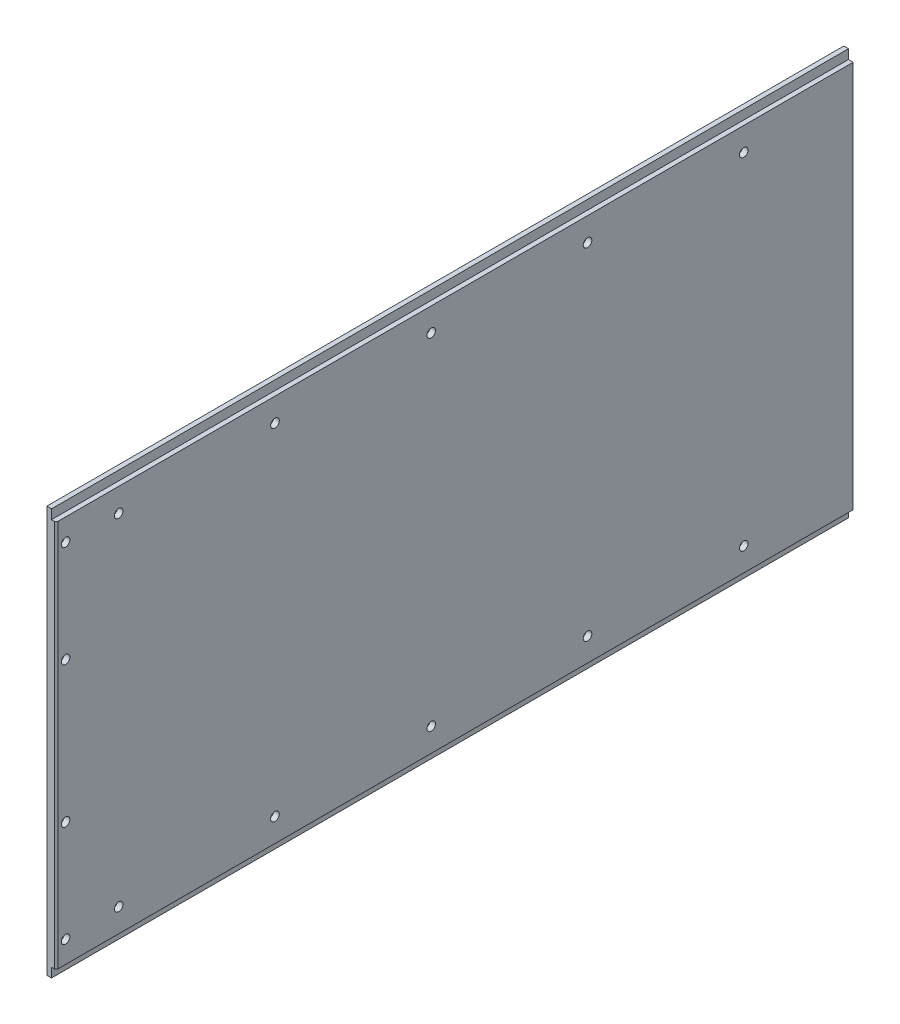
ISO-10303-21;
HEADER;
FILE_DESCRIPTION(('STEP AP214'),'2;1');
FILE_NAME('part.step','',(''),(''),'','','');
FILE_SCHEMA(('AUTOMOTIVE_DESIGN { 1 0 10303 214 1 1 1 1 }'));
ENDSEC;
DATA;
#1=APPLICATION_CONTEXT('core data for automotive mechanical design processes');
#2=APPLICATION_PROTOCOL_DEFINITION('international standard','automotive_design',2000,#1);
#3=PRODUCT_CONTEXT('',#1,'mechanical');
#4=PRODUCT('Part','Part','',(#3));
#5=PRODUCT_RELATED_PRODUCT_CATEGORY('part','',(#4));
#6=PRODUCT_DEFINITION_FORMATION('','',#4);
#7=PRODUCT_DEFINITION_CONTEXT('part definition',#1,'design');
#8=PRODUCT_DEFINITION('design','',#6,#7);
#9=PRODUCT_DEFINITION_SHAPE('','',#8);
#10=(LENGTH_UNIT() NAMED_UNIT(*) SI_UNIT(.MILLI.,.METRE.));
#11=(NAMED_UNIT(*) PLANE_ANGLE_UNIT() SI_UNIT($,.RADIAN.));
#12=(NAMED_UNIT(*) SI_UNIT($,.STERADIAN.) SOLID_ANGLE_UNIT());
#13=UNCERTAINTY_MEASURE_WITH_UNIT(LENGTH_MEASURE(1.E-05),#10,'distance_accuracy_value','');
#14=(GEOMETRIC_REPRESENTATION_CONTEXT(3) GLOBAL_UNCERTAINTY_ASSIGNED_CONTEXT((#13)) GLOBAL_UNIT_ASSIGNED_CONTEXT((#10,
#11,#12)) REPRESENTATION_CONTEXT('',''));
#15=CARTESIAN_POINT('',(0.,0.,0.));
#16=DIRECTION('',(0.,0.,1.));
#17=DIRECTION('',(1.,0.,0.));
#18=AXIS2_PLACEMENT_3D('',#15,#16,#17);
#19=CARTESIAN_POINT('',(6.,-130.,255.));
#20=DIRECTION('',(0.,0.,-1.));
#21=DIRECTION('',(-1.,0.,0.));
#22=AXIS2_PLACEMENT_3D('',#19,#20,#21);
#23=PLANE('',#22);
#24=DIRECTION('',(-1.,0.,0.));
#25=VECTOR('',#24,1.);
#26=CARTESIAN_POINT('',(6.,-124.,255.));
#27=LINE('',#26,#25);
#28=CARTESIAN_POINT('',(5.00000000000006,-124.,255.));
#29=VERTEX_POINT('',#28);
#30=CARTESIAN_POINT('',(3.,-124.,255.));
#31=VERTEX_POINT('',#30);
#32=EDGE_CURVE('E603',#29,#31,#27,.T.);
#33=ORIENTED_EDGE('',*,*,#32,.F.);
#34=DIRECTION('',(0.,1.,0.));
#35=VECTOR('',#34,1.);
#36=CARTESIAN_POINT('',(5.00000000000006,-130.,255.));
#37=LINE('',#36,#35);
#38=CARTESIAN_POINT('',(5.00000000000006,124.,255.));
#39=VERTEX_POINT('',#38);
#40=EDGE_CURVE('E49',#29,#39,#37,.T.);
#41=ORIENTED_EDGE('',*,*,#40,.T.);
#42=DIRECTION('',(1.,0.,0.));
#43=VECTOR('',#42,1.);
#44=CARTESIAN_POINT('',(6.,124.,255.));
#45=LINE('',#44,#43);
#46=CARTESIAN_POINT('',(3.,124.,255.));
#47=VERTEX_POINT('',#46);
#48=EDGE_CURVE('E117',#47,#39,#45,.T.);
#49=ORIENTED_EDGE('',*,*,#48,.F.);
#50=DIRECTION('',(0.,-1.,0.));
#51=VECTOR('',#50,1.);
#52=CARTESIAN_POINT('',(3.,130.,255.));
#53=LINE('',#52,#51);
#54=CARTESIAN_POINT('',(3.,130.,255.));
#55=VERTEX_POINT('',#54);
#56=EDGE_CURVE('E591',#55,#47,#53,.T.);
#57=ORIENTED_EDGE('',*,*,#56,.F.);
#58=DIRECTION('',(-1.,0.,0.));
#59=VECTOR('',#58,1.);
#60=CARTESIAN_POINT('',(6.,130.,255.));
#61=LINE('',#60,#59);
#62=CARTESIAN_POINT('',(0.,130.,255.));
#63=VERTEX_POINT('',#62);
#64=EDGE_CURVE('E125',#55,#63,#61,.T.);
#65=ORIENTED_EDGE('',*,*,#64,.T.);
#66=DIRECTION('',(0.,-1.,0.));
#67=VECTOR('',#66,1.);
#68=CARTESIAN_POINT('',(0.,-130.,255.));
#69=LINE('',#68,#67);
#70=CARTESIAN_POINT('',(0.,-130.,255.));
#71=VERTEX_POINT('',#70);
#72=EDGE_CURVE('E579',#63,#71,#69,.T.);
#73=ORIENTED_EDGE('',*,*,#72,.T.);
#74=DIRECTION('',(-1.,0.,0.));
#75=VECTOR('',#74,1.);
#76=CARTESIAN_POINT('',(6.,-130.,255.));
#77=LINE('',#76,#75);
#78=CARTESIAN_POINT('',(3.,-130.,255.));
#79=VERTEX_POINT('',#78);
#80=EDGE_CURVE('E133',#79,#71,#77,.T.);
#81=ORIENTED_EDGE('',*,*,#80,.F.);
#82=DIRECTION('',(0.,-1.,0.));
#83=VECTOR('',#82,1.);
#84=CARTESIAN_POINT('',(3.,-130.,255.));
#85=LINE('',#84,#83);
#86=EDGE_CURVE('E605',#31,#79,#85,.T.);
#87=ORIENTED_EDGE('',*,*,#86,.F.);
#88=EDGE_LOOP('',(#33,#41,#49,#57,#65,#73,#81,#87));
#89=FACE_BOUND('',#88,.T.);
#90=ADVANCED_FACE('F34',(#89),#23,.F.);
#91=CARTESIAN_POINT('',(6.,-130.,-255.));
#92=DIRECTION('',(0.,1.,0.));
#93=DIRECTION('',(0.,0.,1.));
#94=AXIS2_PLACEMENT_3D('',#91,#92,#93);
#95=PLANE('',#94);
#96=DIRECTION('',(-1.,0.,0.));
#97=VECTOR('',#96,1.);
#98=CARTESIAN_POINT('',(6.,-130.,-255.));
#99=LINE('',#98,#97);
#100=CARTESIAN_POINT('',(3.,-130.,-255.));
#101=VERTEX_POINT('',#100);
#102=CARTESIAN_POINT('',(0.,-130.,-255.));
#103=VERTEX_POINT('',#102);
#104=EDGE_CURVE('E131',#101,#103,#99,.T.);
#105=ORIENTED_EDGE('',*,*,#104,.F.);
#106=DIRECTION('',(0.,0.,1.));
#107=VECTOR('',#106,1.);
#108=CARTESIAN_POINT('',(3.,-130.,-255.));
#109=LINE('',#108,#107);
#110=EDGE_CURVE('E571',#101,#79,#109,.T.);
#111=ORIENTED_EDGE('',*,*,#110,.T.);
#112=ORIENTED_EDGE('',*,*,#80,.T.);
#113=DIRECTION('',(0.,0.,-1.));
#114=VECTOR('',#113,1.);
#115=CARTESIAN_POINT('',(0.,-130.,-255.));
#116=LINE('',#115,#114);
#117=EDGE_CURVE('E582',#71,#103,#116,.T.);
#118=ORIENTED_EDGE('',*,*,#117,.T.);
#119=EDGE_LOOP('',(#105,#111,#112,#118));
#120=FACE_BOUND('',#119,.T.);
#121=ADVANCED_FACE('F201',(#120),#95,.F.);
#122=CARTESIAN_POINT('',(6.,130.,-255.));
#123=DIRECTION('',(0.,0.,1.));
#124=DIRECTION('',(1.,0.,0.));
#125=AXIS2_PLACEMENT_3D('',#122,#123,#124);
#126=PLANE('',#125);
#127=DIRECTION('',(0.,-1.,0.));
#128=VECTOR('',#127,1.);
#129=CARTESIAN_POINT('',(3.,130.,-255.));
#130=LINE('',#129,#128);
#131=CARTESIAN_POINT('',(3.,130.,-255.));
#132=VERTEX_POINT('',#131);
#133=CARTESIAN_POINT('',(3.,124.,-255.));
#134=VERTEX_POINT('',#133);
#135=EDGE_CURVE('E105',#132,#134,#130,.T.);
#136=ORIENTED_EDGE('',*,*,#135,.T.);
#137=DIRECTION('',(1.,0.,0.));
#138=VECTOR('',#137,1.);
#139=CARTESIAN_POINT('',(6.,124.,-255.));
#140=LINE('',#139,#138);
#141=CARTESIAN_POINT('',(6.,124.,-255.));
#142=VERTEX_POINT('',#141);
#143=EDGE_CURVE('E116',#134,#142,#140,.T.);
#144=ORIENTED_EDGE('',*,*,#143,.T.);
#145=DIRECTION('',(0.,1.,0.));
#146=VECTOR('',#145,1.);
#147=CARTESIAN_POINT('',(6.,130.,-255.));
#148=LINE('',#147,#146);
#149=CARTESIAN_POINT('',(6.,-124.,-255.));
#150=VERTEX_POINT('',#149);
#151=EDGE_CURVE('E135',#150,#142,#148,.T.);
#152=ORIENTED_EDGE('',*,*,#151,.F.);
#153=DIRECTION('',(-1.,0.,0.));
#154=VECTOR('',#153,1.);
#155=CARTESIAN_POINT('',(6.,-124.,-255.));
#156=LINE('',#155,#154);
#157=CARTESIAN_POINT('',(3.,-124.,-255.));
#158=VERTEX_POINT('',#157);
#159=EDGE_CURVE('E563',#150,#158,#156,.T.);
#160=ORIENTED_EDGE('',*,*,#159,.T.);
#161=DIRECTION('',(0.,-1.,0.));
#162=VECTOR('',#161,1.);
#163=CARTESIAN_POINT('',(3.,-130.,-255.));
#164=LINE('',#163,#162);
#165=EDGE_CURVE('E568',#158,#101,#164,.T.);
#166=ORIENTED_EDGE('',*,*,#165,.T.);
#167=ORIENTED_EDGE('',*,*,#104,.T.);
#168=DIRECTION('',(0.,1.,0.));
#169=VECTOR('',#168,1.);
#170=CARTESIAN_POINT('',(0.,130.,-255.));
#171=LINE('',#170,#169);
#172=CARTESIAN_POINT('',(0.,130.,-255.));
#173=VERTEX_POINT('',#172);
#174=EDGE_CURVE('E129',#103,#173,#171,.T.);
#175=ORIENTED_EDGE('',*,*,#174,.T.);
#176=DIRECTION('',(-1.,0.,0.));
#177=VECTOR('',#176,1.);
#178=CARTESIAN_POINT('',(6.,130.,-255.));
#179=LINE('',#178,#177);
#180=EDGE_CURVE('E123',#132,#173,#179,.T.);
#181=ORIENTED_EDGE('',*,*,#180,.F.);
#182=EDGE_LOOP('',(#136,#144,#152,#160,#166,#167,#175,#181));
#183=FACE_BOUND('',#182,.T.);
#184=ADVANCED_FACE('F127',(#183),#126,.F.);
#185=CARTESIAN_POINT('',(6.,130.,255.));
#186=DIRECTION('',(0.,-1.,0.));
#187=DIRECTION('',(0.,0.,-1.));
#188=AXIS2_PLACEMENT_3D('',#185,#186,#187);
#189=PLANE('',#188);
#190=ORIENTED_EDGE('',*,*,#64,.F.);
#191=DIRECTION('',(0.,0.,1.));
#192=VECTOR('',#191,1.);
#193=CARTESIAN_POINT('',(3.,130.,-255.));
#194=LINE('',#193,#192);
#195=EDGE_CURVE('E109',#132,#55,#194,.T.);
#196=ORIENTED_EDGE('',*,*,#195,.F.);
#197=ORIENTED_EDGE('',*,*,#180,.T.);
#198=DIRECTION('',(0.,0.,1.));
#199=VECTOR('',#198,1.);
#200=CARTESIAN_POINT('',(0.,130.,255.));
#201=LINE('',#200,#199);
#202=EDGE_CURVE('E578',#173,#63,#201,.T.);
#203=ORIENTED_EDGE('',*,*,#202,.T.);
#204=EDGE_LOOP('',(#190,#196,#197,#203));
#205=FACE_BOUND('',#204,.T.);
#206=ADVANCED_FACE('F121',(#205),#189,.F.);
#207=CARTESIAN_POINT('',(6.,0.,0.));
#208=DIRECTION('',(-1.,0.,0.));
#209=DIRECTION('',(0.,0.,1.));
#210=AXIS2_PLACEMENT_3D('',#207,#208,#209);
#211=PLANE('',#210);
#212=CARTESIAN_POINT('',(6.00000000000001,109.,-185.));
#213=DIRECTION('',(-1.,0.,0.));
#214=DIRECTION('',(0.,0.,1.));
#215=AXIS2_PLACEMENT_3D('',#212,#213,#214);
#216=CIRCLE('',#215,2.74999999999999);
#217=CARTESIAN_POINT('',(6.00000000000001,109.,-182.25));
#218=VERTEX_POINT('',#217);
#219=EDGE_CURVE('E708',#218,#218,#216,.T.);
#220=ORIENTED_EDGE('',*,*,#219,.T.);
#221=EDGE_LOOP('',(#220));
#222=FACE_BOUND('',#221,.T.);
#223=CARTESIAN_POINT('',(6.00000000000001,109.,-85.));
#224=DIRECTION('',(-1.,0.,0.));
#225=DIRECTION('',(0.,0.,1.));
#226=AXIS2_PLACEMENT_3D('',#223,#224,#225);
#227=CIRCLE('',#226,2.74999999999999);
#228=CARTESIAN_POINT('',(6.00000000000001,109.,-82.2500000000001));
#229=VERTEX_POINT('',#228);
#230=EDGE_CURVE('E699',#229,#229,#227,.T.);
#231=ORIENTED_EDGE('',*,*,#230,.T.);
#232=EDGE_LOOP('',(#231));
#233=FACE_BOUND('',#232,.T.);
#234=CARTESIAN_POINT('',(6.00000000000001,109.,15.));
#235=DIRECTION('',(-1.,0.,0.));
#236=DIRECTION('',(0.,0.,1.));
#237=AXIS2_PLACEMENT_3D('',#234,#235,#236);
#238=CIRCLE('',#237,2.74999999999999);
#239=CARTESIAN_POINT('',(6.00000000000001,109.,17.75));
#240=VERTEX_POINT('',#239);
#241=EDGE_CURVE('E690',#240,#240,#238,.T.);
#242=ORIENTED_EDGE('',*,*,#241,.T.);
#243=EDGE_LOOP('',(#242));
#244=FACE_BOUND('',#243,.T.);
#245=CARTESIAN_POINT('',(6.00000000000001,109.,115.));
#246=DIRECTION('',(-1.,0.,0.));
#247=DIRECTION('',(0.,0.,1.));
#248=AXIS2_PLACEMENT_3D('',#245,#246,#247);
#249=CIRCLE('',#248,2.74999999999999);
#250=CARTESIAN_POINT('',(6.00000000000001,109.,117.75));
#251=VERTEX_POINT('',#250);
#252=EDGE_CURVE('E681',#251,#251,#249,.T.);
#253=ORIENTED_EDGE('',*,*,#252,.T.);
#254=EDGE_LOOP('',(#253));
#255=FACE_BOUND('',#254,.T.);
#256=CARTESIAN_POINT('',(6.00000000000001,109.,215.));
#257=DIRECTION('',(-1.,0.,0.));
#258=DIRECTION('',(0.,0.,1.));
#259=AXIS2_PLACEMENT_3D('',#256,#257,#258);
#260=CIRCLE('',#259,2.74999999999999);
#261=CARTESIAN_POINT('',(6.00000000000001,109.,217.75));
#262=VERTEX_POINT('',#261);
#263=EDGE_CURVE('E672',#262,#262,#260,.T.);
#264=ORIENTED_EDGE('',*,*,#263,.T.);
#265=EDGE_LOOP('',(#264));
#266=FACE_BOUND('',#265,.T.);
#267=CARTESIAN_POINT('',(6.00000000000001,110.,249.));
#268=DIRECTION('',(-1.,0.,0.));
#269=DIRECTION('',(0.,0.,1.));
#270=AXIS2_PLACEMENT_3D('',#267,#268,#269);
#271=CIRCLE('',#270,2.74999999999999);
#272=CARTESIAN_POINT('',(6.00000000000001,110.,251.75));
#273=VERTEX_POINT('',#272);
#274=EDGE_CURVE('E663',#273,#273,#271,.T.);
#275=ORIENTED_EDGE('',*,*,#274,.T.);
#276=EDGE_LOOP('',(#275));
#277=FACE_BOUND('',#276,.T.);
#278=CARTESIAN_POINT('',(6.00000000000001,45.,249.));
#279=DIRECTION('',(-1.,0.,0.));
#280=DIRECTION('',(0.,0.,1.));
#281=AXIS2_PLACEMENT_3D('',#278,#279,#280);
#282=CIRCLE('',#281,2.74999999999999);
#283=CARTESIAN_POINT('',(6.00000000000001,45.,251.75));
#284=VERTEX_POINT('',#283);
#285=EDGE_CURVE('E654',#284,#284,#282,.T.);
#286=ORIENTED_EDGE('',*,*,#285,.T.);
#287=EDGE_LOOP('',(#286));
#288=FACE_BOUND('',#287,.T.);
#289=CARTESIAN_POINT('',(6.00000000000001,-109.,115.));
#290=DIRECTION('',(-1.,0.,0.));
#291=DIRECTION('',(0.,0.,1.));
#292=AXIS2_PLACEMENT_3D('',#289,#290,#291);
#293=CIRCLE('',#292,2.74999999999999);
#294=CARTESIAN_POINT('',(6.00000000000001,-109.,117.75));
#295=VERTEX_POINT('',#294);
#296=EDGE_CURVE('E648',#295,#295,#293,.T.);
#297=ORIENTED_EDGE('',*,*,#296,.T.);
#298=EDGE_LOOP('',(#297));
#299=FACE_BOUND('',#298,.T.);
#300=CARTESIAN_POINT('',(6.00000000000001,-109.,215.));
#301=DIRECTION('',(-1.,0.,0.));
#302=DIRECTION('',(0.,0.,1.));
#303=AXIS2_PLACEMENT_3D('',#300,#301,#302);
#304=CIRCLE('',#303,2.74999999999999);
#305=CARTESIAN_POINT('',(6.00000000000001,-109.,217.75));
#306=VERTEX_POINT('',#305);
#307=EDGE_CURVE('E636',#306,#306,#304,.T.);
#308=ORIENTED_EDGE('',*,*,#307,.T.);
#309=EDGE_LOOP('',(#308));
#310=FACE_BOUND('',#309,.T.);
#311=CARTESIAN_POINT('',(6.00000000000001,-110.,249.));
#312=DIRECTION('',(-1.,0.,0.));
#313=DIRECTION('',(0.,0.,1.));
#314=AXIS2_PLACEMENT_3D('',#311,#312,#313);
#315=CIRCLE('',#314,2.74999999999999);
#316=CARTESIAN_POINT('',(6.00000000000001,-110.,251.75));
#317=VERTEX_POINT('',#316);
#318=EDGE_CURVE('E627',#317,#317,#315,.T.);
#319=ORIENTED_EDGE('',*,*,#318,.T.);
#320=EDGE_LOOP('',(#319));
#321=FACE_BOUND('',#320,.T.);
#322=CARTESIAN_POINT('',(6.00000000000001,-45.,249.));
#323=DIRECTION('',(-1.,0.,0.));
#324=DIRECTION('',(0.,0.,1.));
#325=AXIS2_PLACEMENT_3D('',#322,#323,#324);
#326=CIRCLE('',#325,2.74999999999999);
#327=CARTESIAN_POINT('',(6.00000000000001,-45.,251.75));
#328=VERTEX_POINT('',#327);
#329=EDGE_CURVE('E592',#328,#328,#326,.T.);
#330=ORIENTED_EDGE('',*,*,#329,.T.);
#331=EDGE_LOOP('',(#330));
#332=FACE_BOUND('',#331,.T.);
#333=DIRECTION('',(0.,0.,1.));
#334=VECTOR('',#333,1.);
#335=CARTESIAN_POINT('',(6.,124.,-255.));
#336=LINE('',#335,#334);
#337=CARTESIAN_POINT('',(6.,124.,254.));
#338=VERTEX_POINT('',#337);
#339=EDGE_CURVE('E600',#142,#338,#336,.T.);
#340=ORIENTED_EDGE('',*,*,#339,.T.);
#341=DIRECTION('',(0.,-1.,0.));
#342=VECTOR('',#341,1.);
#343=CARTESIAN_POINT('',(6.,0.,254.));
#344=LINE('',#343,#342);
#345=CARTESIAN_POINT('',(6.,-124.,254.));
#346=VERTEX_POINT('',#345);
#347=EDGE_CURVE('E140',#338,#346,#344,.T.);
#348=ORIENTED_EDGE('',*,*,#347,.T.);
#349=DIRECTION('',(0.,0.,1.));
#350=VECTOR('',#349,1.);
#351=CARTESIAN_POINT('',(6.,-124.,-255.));
#352=LINE('',#351,#350);
#353=EDGE_CURVE('E561',#150,#346,#352,.T.);
#354=ORIENTED_EDGE('',*,*,#353,.F.);
#355=ORIENTED_EDGE('',*,*,#151,.T.);
#356=EDGE_LOOP('',(#340,#348,#354,#355));
#357=FACE_BOUND('',#356,.T.);
#358=CARTESIAN_POINT('',(6.00000000000001,-109.,15.));
#359=DIRECTION('',(-1.,0.,0.));
#360=DIRECTION('',(0.,0.,1.));
#361=AXIS2_PLACEMENT_3D('',#358,#359,#360);
#362=CIRCLE('',#361,2.74999999999999);
#363=CARTESIAN_POINT('',(6.00000000000001,-109.,17.75));
#364=VERTEX_POINT('',#363);
#365=EDGE_CURVE('E150',#364,#364,#362,.T.);
#366=ORIENTED_EDGE('',*,*,#365,.T.);
#367=EDGE_LOOP('',(#366));
#368=FACE_BOUND('',#367,.T.);
#369=CARTESIAN_POINT('',(6.00000000000001,-109.,-85.));
#370=DIRECTION('',(-1.,0.,0.));
#371=DIRECTION('',(0.,0.,1.));
#372=AXIS2_PLACEMENT_3D('',#369,#370,#371);
#373=CIRCLE('',#372,2.74999999999999);
#374=CARTESIAN_POINT('',(6.00000000000001,-109.,-82.2500000000001));
#375=VERTEX_POINT('',#374);
#376=EDGE_CURVE('E159',#375,#375,#373,.T.);
#377=ORIENTED_EDGE('',*,*,#376,.T.);
#378=EDGE_LOOP('',(#377));
#379=FACE_BOUND('',#378,.T.);
#380=CARTESIAN_POINT('',(6.00000000000001,-109.,-185.));
#381=DIRECTION('',(-1.,0.,0.));
#382=DIRECTION('',(0.,0.,1.));
#383=AXIS2_PLACEMENT_3D('',#380,#381,#382);
#384=CIRCLE('',#383,2.74999999999999);
#385=CARTESIAN_POINT('',(6.00000000000001,-109.,-182.25));
#386=VERTEX_POINT('',#385);
#387=EDGE_CURVE('E42',#386,#386,#384,.T.);
#388=ORIENTED_EDGE('',*,*,#387,.T.);
#389=EDGE_LOOP('',(#388));
#390=FACE_BOUND('',#389,.T.);
#391=ADVANCED_FACE('F170',(#222,#233,#244,#255,#266,#277,#288,#299,#310,#321,#332,#357,#368,
#379,#390),#211,.F.);
#392=CARTESIAN_POINT('',(0.,0.,0.));
#393=DIRECTION('',(-1.,0.,0.));
#394=DIRECTION('',(0.,0.,1.));
#395=AXIS2_PLACEMENT_3D('',#392,#393,#394);
#396=PLANE('',#395);
#397=CARTESIAN_POINT('',(0.,109.,-185.));
#398=DIRECTION('',(-1.,0.,0.));
#399=DIRECTION('',(0.,0.,1.));
#400=AXIS2_PLACEMENT_3D('',#397,#398,#399);
#401=CIRCLE('',#400,5.2);
#402=CARTESIAN_POINT('',(0.,109.,-179.8));
#403=VERTEX_POINT('',#402);
#404=EDGE_CURVE('E714',#403,#403,#401,.T.);
#405=ORIENTED_EDGE('',*,*,#404,.F.);
#406=EDGE_LOOP('',(#405));
#407=FACE_BOUND('',#406,.T.);
#408=CARTESIAN_POINT('',(0.,109.,-85.));
#409=DIRECTION('',(-1.,0.,0.));
#410=DIRECTION('',(0.,0.,1.));
#411=AXIS2_PLACEMENT_3D('',#408,#409,#410);
#412=CIRCLE('',#411,5.2);
#413=CARTESIAN_POINT('',(0.,109.,-79.8000000000001));
#414=VERTEX_POINT('',#413);
#415=EDGE_CURVE('E705',#414,#414,#412,.T.);
#416=ORIENTED_EDGE('',*,*,#415,.F.);
#417=EDGE_LOOP('',(#416));
#418=FACE_BOUND('',#417,.T.);
#419=CARTESIAN_POINT('',(0.,109.,15.));
#420=DIRECTION('',(-1.,0.,0.));
#421=DIRECTION('',(0.,0.,1.));
#422=AXIS2_PLACEMENT_3D('',#419,#420,#421);
#423=CIRCLE('',#422,5.2);
#424=CARTESIAN_POINT('',(0.,109.,20.2));
#425=VERTEX_POINT('',#424);
#426=EDGE_CURVE('E696',#425,#425,#423,.T.);
#427=ORIENTED_EDGE('',*,*,#426,.F.);
#428=EDGE_LOOP('',(#427));
#429=FACE_BOUND('',#428,.T.);
#430=CARTESIAN_POINT('',(0.,109.,115.));
#431=DIRECTION('',(-1.,0.,0.));
#432=DIRECTION('',(0.,0.,1.));
#433=AXIS2_PLACEMENT_3D('',#430,#431,#432);
#434=CIRCLE('',#433,5.2);
#435=CARTESIAN_POINT('',(0.,109.,120.2));
#436=VERTEX_POINT('',#435);
#437=EDGE_CURVE('E687',#436,#436,#434,.T.);
#438=ORIENTED_EDGE('',*,*,#437,.F.);
#439=EDGE_LOOP('',(#438));
#440=FACE_BOUND('',#439,.T.);
#441=CARTESIAN_POINT('',(0.,109.,215.));
#442=DIRECTION('',(-1.,0.,0.));
#443=DIRECTION('',(0.,0.,1.));
#444=AXIS2_PLACEMENT_3D('',#441,#442,#443);
#445=CIRCLE('',#444,5.2);
#446=CARTESIAN_POINT('',(0.,109.,220.2));
#447=VERTEX_POINT('',#446);
#448=EDGE_CURVE('E678',#447,#447,#445,.T.);
#449=ORIENTED_EDGE('',*,*,#448,.F.);
#450=EDGE_LOOP('',(#449));
#451=FACE_BOUND('',#450,.T.);
#452=CARTESIAN_POINT('',(0.,110.,249.));
#453=DIRECTION('',(-1.,0.,0.));
#454=DIRECTION('',(0.,0.,1.));
#455=AXIS2_PLACEMENT_3D('',#452,#453,#454);
#456=CIRCLE('',#455,5.2);
#457=CARTESIAN_POINT('',(0.,110.,254.2));
#458=VERTEX_POINT('',#457);
#459=EDGE_CURVE('E669',#458,#458,#456,.T.);
#460=ORIENTED_EDGE('',*,*,#459,.F.);
#461=EDGE_LOOP('',(#460));
#462=FACE_BOUND('',#461,.T.);
#463=CARTESIAN_POINT('',(0.,45.,249.));
#464=DIRECTION('',(-1.,0.,0.));
#465=DIRECTION('',(0.,0.,1.));
#466=AXIS2_PLACEMENT_3D('',#463,#464,#465);
#467=CIRCLE('',#466,5.2);
#468=CARTESIAN_POINT('',(0.,45.,254.2));
#469=VERTEX_POINT('',#468);
#470=EDGE_CURVE('E660',#469,#469,#467,.T.);
#471=ORIENTED_EDGE('',*,*,#470,.F.);
#472=EDGE_LOOP('',(#471));
#473=FACE_BOUND('',#472,.T.);
#474=CARTESIAN_POINT('',(0.,-109.,115.));
#475=DIRECTION('',(-1.,0.,0.));
#476=DIRECTION('',(0.,0.,1.));
#477=AXIS2_PLACEMENT_3D('',#474,#475,#476);
#478=CIRCLE('',#477,5.2);
#479=CARTESIAN_POINT('',(0.,-109.,120.2));
#480=VERTEX_POINT('',#479);
#481=EDGE_CURVE('E651',#480,#480,#478,.T.);
#482=ORIENTED_EDGE('',*,*,#481,.F.);
#483=EDGE_LOOP('',(#482));
#484=FACE_BOUND('',#483,.T.);
#485=CARTESIAN_POINT('',(0.,-109.,215.));
#486=DIRECTION('',(-1.,0.,0.));
#487=DIRECTION('',(0.,0.,1.));
#488=AXIS2_PLACEMENT_3D('',#485,#486,#487);
#489=CIRCLE('',#488,5.2);
#490=CARTESIAN_POINT('',(0.,-109.,220.2));
#491=VERTEX_POINT('',#490);
#492=EDGE_CURVE('E642',#491,#491,#489,.T.);
#493=ORIENTED_EDGE('',*,*,#492,.F.);
#494=EDGE_LOOP('',(#493));
#495=FACE_BOUND('',#494,.T.);
#496=CARTESIAN_POINT('',(0.,-110.,249.));
#497=DIRECTION('',(-1.,0.,0.));
#498=DIRECTION('',(0.,0.,1.));
#499=AXIS2_PLACEMENT_3D('',#496,#497,#498);
#500=CIRCLE('',#499,5.2);
#501=CARTESIAN_POINT('',(0.,-110.,254.2));
#502=VERTEX_POINT('',#501);
#503=EDGE_CURVE('E633',#502,#502,#500,.T.);
#504=ORIENTED_EDGE('',*,*,#503,.F.);
#505=EDGE_LOOP('',(#504));
#506=FACE_BOUND('',#505,.T.);
#507=CARTESIAN_POINT('',(0.,-45.,249.));
#508=DIRECTION('',(-1.,0.,0.));
#509=DIRECTION('',(0.,0.,1.));
#510=AXIS2_PLACEMENT_3D('',#507,#508,#509);
#511=CIRCLE('',#510,5.2);
#512=CARTESIAN_POINT('',(0.,-45.,254.2));
#513=VERTEX_POINT('',#512);
#514=EDGE_CURVE('E624',#513,#513,#511,.T.);
#515=ORIENTED_EDGE('',*,*,#514,.F.);
#516=EDGE_LOOP('',(#515));
#517=FACE_BOUND('',#516,.T.);
#518=ORIENTED_EDGE('',*,*,#72,.F.);
#519=ORIENTED_EDGE('',*,*,#202,.F.);
#520=ORIENTED_EDGE('',*,*,#174,.F.);
#521=ORIENTED_EDGE('',*,*,#117,.F.);
#522=EDGE_LOOP('',(#518,#519,#520,#521));
#523=FACE_BOUND('',#522,.T.);
#524=CARTESIAN_POINT('',(0.,-109.,15.));
#525=DIRECTION('',(-1.,0.,0.));
#526=DIRECTION('',(0.,0.,1.));
#527=AXIS2_PLACEMENT_3D('',#524,#525,#526);
#528=CIRCLE('',#527,5.2);
#529=CARTESIAN_POINT('',(0.,-109.,20.2));
#530=VERTEX_POINT('',#529);
#531=EDGE_CURVE('E147',#530,#530,#528,.T.);
#532=ORIENTED_EDGE('',*,*,#531,.F.);
#533=EDGE_LOOP('',(#532));
#534=FACE_BOUND('',#533,.T.);
#535=CARTESIAN_POINT('',(0.,-109.,-85.));
#536=DIRECTION('',(-1.,0.,0.));
#537=DIRECTION('',(0.,0.,1.));
#538=AXIS2_PLACEMENT_3D('',#535,#536,#537);
#539=CIRCLE('',#538,5.2);
#540=CARTESIAN_POINT('',(0.,-109.,-79.8000000000001));
#541=VERTEX_POINT('',#540);
#542=EDGE_CURVE('E156',#541,#541,#539,.T.);
#543=ORIENTED_EDGE('',*,*,#542,.F.);
#544=EDGE_LOOP('',(#543));
#545=FACE_BOUND('',#544,.T.);
#546=CARTESIAN_POINT('',(0.,-109.,-185.));
#547=DIRECTION('',(-1.,0.,0.));
#548=DIRECTION('',(0.,0.,1.));
#549=AXIS2_PLACEMENT_3D('',#546,#547,#548);
#550=CIRCLE('',#549,5.2);
#551=CARTESIAN_POINT('',(0.,-109.,-179.8));
#552=VERTEX_POINT('',#551);
#553=EDGE_CURVE('E165',#552,#552,#550,.T.);
#554=ORIENTED_EDGE('',*,*,#553,.F.);
#555=EDGE_LOOP('',(#554));
#556=FACE_BOUND('',#555,.T.);
#557=ADVANCED_FACE('F183',(#407,#418,#429,#440,#451,#462,#473,#484,#495,#506,#517,#523,#534,
#545,#556),#396,.T.);
#558=CARTESIAN_POINT('',(3.,-130.,-255.));
#559=DIRECTION('',(-1.,0.,0.));
#560=DIRECTION('',(0.,0.,1.));
#561=AXIS2_PLACEMENT_3D('',#558,#559,#560);
#562=PLANE('',#561);
#563=ORIENTED_EDGE('',*,*,#86,.T.);
#564=ORIENTED_EDGE('',*,*,#110,.F.);
#565=ORIENTED_EDGE('',*,*,#165,.F.);
#566=DIRECTION('',(0.,0.,1.));
#567=VECTOR('',#566,1.);
#568=CARTESIAN_POINT('',(3.,-124.,-255.));
#569=LINE('',#568,#567);
#570=EDGE_CURVE('E567',#158,#31,#569,.T.);
#571=ORIENTED_EDGE('',*,*,#570,.T.);
#572=EDGE_LOOP('',(#563,#564,#565,#571));
#573=FACE_BOUND('',#572,.T.);
#574=ADVANCED_FACE('F185',(#573),#562,.F.);
#575=CARTESIAN_POINT('',(6.,-124.,-255.));
#576=DIRECTION('',(0.,1.,0.));
#577=DIRECTION('',(0.,0.,1.));
#578=AXIS2_PLACEMENT_3D('',#575,#576,#577);
#579=PLANE('',#578);
#580=ORIENTED_EDGE('',*,*,#353,.T.);
#581=DIRECTION('',(0.707106781186528,0.,-0.707106781186567));
#582=VECTOR('',#581,1.);
#583=CARTESIAN_POINT('',(6.,-124.,254.));
#584=LINE('',#583,#582);
#585=EDGE_CURVE('E57',#346,#29,#584,.F.);
#586=ORIENTED_EDGE('',*,*,#585,.T.);
#587=ORIENTED_EDGE('',*,*,#32,.T.);
#588=ORIENTED_EDGE('',*,*,#570,.F.);
#589=ORIENTED_EDGE('',*,*,#159,.F.);
#590=EDGE_LOOP('',(#580,#586,#587,#588,#589));
#591=FACE_BOUND('',#590,.T.);
#592=ADVANCED_FACE('F192',(#591),#579,.F.);
#593=CARTESIAN_POINT('',(6.,124.,-255.));
#594=DIRECTION('',(0.,-1.,0.));
#595=DIRECTION('',(0.,0.,-1.));
#596=AXIS2_PLACEMENT_3D('',#593,#594,#595);
#597=PLANE('',#596);
#598=ORIENTED_EDGE('',*,*,#48,.T.);
#599=DIRECTION('',(-0.707106781186528,0.,0.707106781186567));
#600=VECTOR('',#599,1.);
#601=CARTESIAN_POINT('',(6.,124.,254.));
#602=LINE('',#601,#600);
#603=EDGE_CURVE('E145',#39,#338,#602,.F.);
#604=ORIENTED_EDGE('',*,*,#603,.T.);
#605=ORIENTED_EDGE('',*,*,#339,.F.);
#606=ORIENTED_EDGE('',*,*,#143,.F.);
#607=DIRECTION('',(0.,0.,1.));
#608=VECTOR('',#607,1.);
#609=CARTESIAN_POINT('',(3.,124.,-255.));
#610=LINE('',#609,#608);
#611=EDGE_CURVE('E111',#134,#47,#610,.T.);
#612=ORIENTED_EDGE('',*,*,#611,.T.);
#613=EDGE_LOOP('',(#598,#604,#605,#606,#612));
#614=FACE_BOUND('',#613,.T.);
#615=ADVANCED_FACE('F492',(#614),#597,.F.);
#616=CARTESIAN_POINT('',(3.,130.,-255.));
#617=DIRECTION('',(-1.,0.,0.));
#618=DIRECTION('',(0.,0.,1.));
#619=AXIS2_PLACEMENT_3D('',#616,#617,#618);
#620=PLANE('',#619);
#621=ORIENTED_EDGE('',*,*,#56,.T.);
#622=ORIENTED_EDGE('',*,*,#611,.F.);
#623=ORIENTED_EDGE('',*,*,#135,.F.);
#624=ORIENTED_EDGE('',*,*,#195,.T.);
#625=EDGE_LOOP('',(#621,#622,#623,#624));
#626=FACE_BOUND('',#625,.T.);
#627=ADVANCED_FACE('F108',(#626),#620,.F.);
#628=CARTESIAN_POINT('',(0.,-45.,249.));
#629=DIRECTION('',(-1.,0.,0.));
#630=DIRECTION('',(0.,0.,1.));
#631=AXIS2_PLACEMENT_3D('',#628,#629,#630);
#632=CYLINDRICAL_SURFACE('',#631,2.74999999999999);
#633=ORIENTED_EDGE('',*,*,#329,.F.);
#634=EDGE_LOOP('',(#633));
#635=FACE_BOUND('',#634,.T.);
#636=CARTESIAN_POINT('',(2.45000000000001,-45.,249.));
#637=DIRECTION('',(-1.,0.,0.));
#638=DIRECTION('',(0.,0.,1.));
#639=AXIS2_PLACEMENT_3D('',#636,#637,#638);
#640=CIRCLE('',#639,2.74999999999999);
#641=CARTESIAN_POINT('',(2.45000000000001,-45.,251.75));
#642=VERTEX_POINT('',#641);
#643=EDGE_CURVE('E596',#642,#642,#640,.T.);
#644=ORIENTED_EDGE('',*,*,#643,.T.);
#645=EDGE_LOOP('',(#644));
#646=FACE_BOUND('',#645,.T.);
#647=ADVANCED_FACE('F475',(#635,#646),#632,.F.);
#648=CARTESIAN_POINT('',(0.,-45.,249.));
#649=DIRECTION('',(-1.,0.,0.));
#650=DIRECTION('',(0.,0.,1.));
#651=AXIS2_PLACEMENT_3D('',#648,#649,#650);
#652=CONICAL_SURFACE('',#651,5.2,0.785398163397448);
#653=ORIENTED_EDGE('',*,*,#643,.F.);
#654=EDGE_LOOP('',(#653));
#655=FACE_BOUND('',#654,.T.);
#656=ORIENTED_EDGE('',*,*,#514,.T.);
#657=EDGE_LOOP('',(#656));
#658=FACE_BOUND('',#657,.T.);
#659=ADVANCED_FACE('F466',(#655,#658),#652,.F.);
#660=CARTESIAN_POINT('',(0.,-110.,249.));
#661=DIRECTION('',(-1.,0.,0.));
#662=DIRECTION('',(0.,0.,1.));
#663=AXIS2_PLACEMENT_3D('',#660,#661,#662);
#664=CYLINDRICAL_SURFACE('',#663,2.74999999999999);
#665=ORIENTED_EDGE('',*,*,#318,.F.);
#666=EDGE_LOOP('',(#665));
#667=FACE_BOUND('',#666,.T.);
#668=CARTESIAN_POINT('',(2.45000000000001,-110.,249.));
#669=DIRECTION('',(-1.,0.,0.));
#670=DIRECTION('',(0.,0.,1.));
#671=AXIS2_PLACEMENT_3D('',#668,#669,#670);
#672=CIRCLE('',#671,2.74999999999999);
#673=CARTESIAN_POINT('',(2.45000000000001,-110.,251.75));
#674=VERTEX_POINT('',#673);
#675=EDGE_CURVE('E630',#674,#674,#672,.T.);
#676=ORIENTED_EDGE('',*,*,#675,.T.);
#677=EDGE_LOOP('',(#676));
#678=FACE_BOUND('',#677,.T.);
#679=ADVANCED_FACE('F457',(#667,#678),#664,.F.);
#680=CARTESIAN_POINT('',(0.,-110.,249.));
#681=DIRECTION('',(-1.,0.,0.));
#682=DIRECTION('',(0.,0.,1.));
#683=AXIS2_PLACEMENT_3D('',#680,#681,#682);
#684=CONICAL_SURFACE('',#683,5.2,0.785398163397448);
#685=ORIENTED_EDGE('',*,*,#675,.F.);
#686=EDGE_LOOP('',(#685));
#687=FACE_BOUND('',#686,.T.);
#688=ORIENTED_EDGE('',*,*,#503,.T.);
#689=EDGE_LOOP('',(#688));
#690=FACE_BOUND('',#689,.T.);
#691=ADVANCED_FACE('F214',(#687,#690),#684,.F.);
#692=CARTESIAN_POINT('',(6.,0.,254.));
#693=DIRECTION('',(-0.707106781186567,0.,-0.707106781186528));
#694=DIRECTION('',(0.,-1.,0.));
#695=AXIS2_PLACEMENT_3D('',#692,#693,#694);
#696=PLANE('',#695);
#697=ORIENTED_EDGE('',*,*,#603,.F.);
#698=ORIENTED_EDGE('',*,*,#40,.F.);
#699=ORIENTED_EDGE('',*,*,#585,.F.);
#700=ORIENTED_EDGE('',*,*,#347,.F.);
#701=EDGE_LOOP('',(#697,#698,#699,#700));
#702=FACE_BOUND('',#701,.T.);
#703=ADVANCED_FACE('F210',(#702),#696,.F.);
#704=CARTESIAN_POINT('',(0.,-109.,215.));
#705=DIRECTION('',(-1.,0.,0.));
#706=DIRECTION('',(0.,0.,1.));
#707=AXIS2_PLACEMENT_3D('',#704,#705,#706);
#708=CYLINDRICAL_SURFACE('',#707,2.75);
#709=ORIENTED_EDGE('',*,*,#307,.F.);
#710=EDGE_LOOP('',(#709));
#711=FACE_BOUND('',#710,.T.);
#712=CARTESIAN_POINT('',(2.45,-109.,215.));
#713=DIRECTION('',(-1.,0.,0.));
#714=DIRECTION('',(0.,0.,1.));
#715=AXIS2_PLACEMENT_3D('',#712,#713,#714);
#716=CIRCLE('',#715,2.75);
#717=CARTESIAN_POINT('',(2.45,-109.,217.75));
#718=VERTEX_POINT('',#717);
#719=EDGE_CURVE('E639',#718,#718,#716,.T.);
#720=ORIENTED_EDGE('',*,*,#719,.T.);
#721=EDGE_LOOP('',(#720));
#722=FACE_BOUND('',#721,.T.);
#723=ADVANCED_FACE('F213',(#711,#722),#708,.F.);
#724=CARTESIAN_POINT('',(0.,-109.,215.));
#725=DIRECTION('',(-1.,0.,0.));
#726=DIRECTION('',(0.,0.,1.));
#727=AXIS2_PLACEMENT_3D('',#724,#725,#726);
#728=CONICAL_SURFACE('',#727,5.2,0.785398163397446);
#729=ORIENTED_EDGE('',*,*,#719,.F.);
#730=EDGE_LOOP('',(#729));
#731=FACE_BOUND('',#730,.T.);
#732=ORIENTED_EDGE('',*,*,#492,.T.);
#733=EDGE_LOOP('',(#732));
#734=FACE_BOUND('',#733,.T.);
#735=ADVANCED_FACE('F426',(#731,#734),#728,.F.);
#736=CARTESIAN_POINT('',(0.,-109.,115.));
#737=DIRECTION('',(-1.,0.,0.));
#738=DIRECTION('',(0.,0.,1.));
#739=AXIS2_PLACEMENT_3D('',#736,#737,#738);
#740=CYLINDRICAL_SURFACE('',#739,2.75);
#741=ORIENTED_EDGE('',*,*,#296,.F.);
#742=EDGE_LOOP('',(#741));
#743=FACE_BOUND('',#742,.T.);
#744=CARTESIAN_POINT('',(2.45,-109.,115.));
#745=DIRECTION('',(-1.,0.,0.));
#746=DIRECTION('',(0.,0.,1.));
#747=AXIS2_PLACEMENT_3D('',#744,#745,#746);
#748=CIRCLE('',#747,2.75);
#749=CARTESIAN_POINT('',(2.45,-109.,117.75));
#750=VERTEX_POINT('',#749);
#751=EDGE_CURVE('E645',#750,#750,#748,.T.);
#752=ORIENTED_EDGE('',*,*,#751,.T.);
#753=EDGE_LOOP('',(#752));
#754=FACE_BOUND('',#753,.T.);
#755=ADVANCED_FACE('F417',(#743,#754),#740,.F.);
#756=CARTESIAN_POINT('',(0.,-109.,115.));
#757=DIRECTION('',(-1.,0.,0.));
#758=DIRECTION('',(0.,0.,1.));
#759=AXIS2_PLACEMENT_3D('',#756,#757,#758);
#760=CONICAL_SURFACE('',#759,5.2,0.785398163397446);
#761=ORIENTED_EDGE('',*,*,#751,.F.);
#762=EDGE_LOOP('',(#761));
#763=FACE_BOUND('',#762,.T.);
#764=ORIENTED_EDGE('',*,*,#481,.T.);
#765=EDGE_LOOP('',(#764));
#766=FACE_BOUND('',#765,.T.);
#767=ADVANCED_FACE('F224',(#763,#766),#760,.F.);
#768=CARTESIAN_POINT('',(0.,-109.,15.));
#769=DIRECTION('',(-1.,0.,0.));
#770=DIRECTION('',(0.,0.,1.));
#771=AXIS2_PLACEMENT_3D('',#768,#769,#770);
#772=CONICAL_SURFACE('',#771,5.2,0.785398163397446);
#773=CARTESIAN_POINT('',(2.45,-109.,15.));
#774=DIRECTION('',(-1.,0.,0.));
#775=DIRECTION('',(0.,0.,1.));
#776=AXIS2_PLACEMENT_3D('',#773,#774,#775);
#777=CIRCLE('',#776,2.75);
#778=CARTESIAN_POINT('',(2.45,-109.,17.75));
#779=VERTEX_POINT('',#778);
#780=EDGE_CURVE('E153',#779,#779,#777,.T.);
#781=ORIENTED_EDGE('',*,*,#780,.F.);
#782=EDGE_LOOP('',(#781));
#783=FACE_BOUND('',#782,.T.);
#784=ORIENTED_EDGE('',*,*,#531,.T.);
#785=EDGE_LOOP('',(#784));
#786=FACE_BOUND('',#785,.T.);
#787=ADVANCED_FACE('F220',(#783,#786),#772,.F.);
#788=CARTESIAN_POINT('',(0.,-109.,15.));
#789=DIRECTION('',(-1.,0.,0.));
#790=DIRECTION('',(0.,0.,1.));
#791=AXIS2_PLACEMENT_3D('',#788,#789,#790);
#792=CYLINDRICAL_SURFACE('',#791,2.75);
#793=ORIENTED_EDGE('',*,*,#365,.F.);
#794=EDGE_LOOP('',(#793));
#795=FACE_BOUND('',#794,.T.);
#796=ORIENTED_EDGE('',*,*,#780,.T.);
#797=EDGE_LOOP('',(#796));
#798=FACE_BOUND('',#797,.T.);
#799=ADVANCED_FACE('F216',(#795,#798),#792,.F.);
#800=CARTESIAN_POINT('',(0.,-109.,-85.));
#801=DIRECTION('',(-1.,0.,0.));
#802=DIRECTION('',(0.,0.,1.));
#803=AXIS2_PLACEMENT_3D('',#800,#801,#802);
#804=CONICAL_SURFACE('',#803,5.2,0.785398163397446);
#805=CARTESIAN_POINT('',(2.45,-109.,-85.));
#806=DIRECTION('',(-1.,0.,0.));
#807=DIRECTION('',(0.,0.,1.));
#808=AXIS2_PLACEMENT_3D('',#805,#806,#807);
#809=CIRCLE('',#808,2.75);
#810=CARTESIAN_POINT('',(2.45,-109.,-82.25));
#811=VERTEX_POINT('',#810);
#812=EDGE_CURVE('E162',#811,#811,#809,.T.);
#813=ORIENTED_EDGE('',*,*,#812,.F.);
#814=EDGE_LOOP('',(#813));
#815=FACE_BOUND('',#814,.T.);
#816=ORIENTED_EDGE('',*,*,#542,.T.);
#817=EDGE_LOOP('',(#816));
#818=FACE_BOUND('',#817,.T.);
#819=ADVANCED_FACE('F219',(#815,#818),#804,.F.);
#820=CARTESIAN_POINT('',(0.,-109.,-85.));
#821=DIRECTION('',(-1.,0.,0.));
#822=DIRECTION('',(0.,0.,1.));
#823=AXIS2_PLACEMENT_3D('',#820,#821,#822);
#824=CYLINDRICAL_SURFACE('',#823,2.75);
#825=ORIENTED_EDGE('',*,*,#376,.F.);
#826=EDGE_LOOP('',(#825));
#827=FACE_BOUND('',#826,.T.);
#828=ORIENTED_EDGE('',*,*,#812,.T.);
#829=EDGE_LOOP('',(#828));
#830=FACE_BOUND('',#829,.T.);
#831=ADVANCED_FACE('F180',(#827,#830),#824,.F.);
#832=CARTESIAN_POINT('',(0.,-109.,-185.));
#833=DIRECTION('',(-1.,0.,0.));
#834=DIRECTION('',(0.,0.,1.));
#835=AXIS2_PLACEMENT_3D('',#832,#833,#834);
#836=CONICAL_SURFACE('',#835,5.2,0.785398163397446);
#837=CARTESIAN_POINT('',(2.45,-109.,-185.));
#838=DIRECTION('',(-1.,0.,0.));
#839=DIRECTION('',(0.,0.,1.));
#840=AXIS2_PLACEMENT_3D('',#837,#838,#839);
#841=CIRCLE('',#840,2.75);
#842=CARTESIAN_POINT('',(2.45,-109.,-182.25));
#843=VERTEX_POINT('',#842);
#844=EDGE_CURVE('E11',#843,#843,#841,.T.);
#845=ORIENTED_EDGE('',*,*,#844,.F.);
#846=EDGE_LOOP('',(#845));
#847=FACE_BOUND('',#846,.T.);
#848=ORIENTED_EDGE('',*,*,#553,.T.);
#849=EDGE_LOOP('',(#848));
#850=FACE_BOUND('',#849,.T.);
#851=ADVANCED_FACE('F36',(#847,#850),#836,.F.);
#852=CARTESIAN_POINT('',(0.,-109.,-185.));
#853=DIRECTION('',(-1.,0.,0.));
#854=DIRECTION('',(0.,0.,1.));
#855=AXIS2_PLACEMENT_3D('',#852,#853,#854);
#856=CYLINDRICAL_SURFACE('',#855,2.75);
#857=ORIENTED_EDGE('',*,*,#387,.F.);
#858=EDGE_LOOP('',(#857));
#859=FACE_BOUND('',#858,.T.);
#860=ORIENTED_EDGE('',*,*,#844,.T.);
#861=EDGE_LOOP('',(#860));
#862=FACE_BOUND('',#861,.T.);
#863=ADVANCED_FACE('F172',(#859,#862),#856,.F.);
#864=CARTESIAN_POINT('',(0.,45.,249.));
#865=DIRECTION('',(-1.,0.,0.));
#866=DIRECTION('',(0.,0.,1.));
#867=AXIS2_PLACEMENT_3D('',#864,#865,#866);
#868=CYLINDRICAL_SURFACE('',#867,2.74999999999999);
#869=ORIENTED_EDGE('',*,*,#285,.F.);
#870=EDGE_LOOP('',(#869));
#871=FACE_BOUND('',#870,.T.);
#872=CARTESIAN_POINT('',(2.45000000000001,45.,249.));
#873=DIRECTION('',(-1.,0.,0.));
#874=DIRECTION('',(0.,0.,1.));
#875=AXIS2_PLACEMENT_3D('',#872,#873,#874);
#876=CIRCLE('',#875,2.74999999999999);
#877=CARTESIAN_POINT('',(2.45000000000001,45.,251.75));
#878=VERTEX_POINT('',#877);
#879=EDGE_CURVE('E657',#878,#878,#876,.T.);
#880=ORIENTED_EDGE('',*,*,#879,.T.);
#881=EDGE_LOOP('',(#880));
#882=FACE_BOUND('',#881,.T.);
#883=ADVANCED_FACE('F175',(#871,#882),#868,.F.);
#884=CARTESIAN_POINT('',(0.,45.,249.));
#885=DIRECTION('',(-1.,0.,0.));
#886=DIRECTION('',(0.,0.,1.));
#887=AXIS2_PLACEMENT_3D('',#884,#885,#886);
#888=CONICAL_SURFACE('',#887,5.2,0.785398163397448);
#889=ORIENTED_EDGE('',*,*,#879,.F.);
#890=EDGE_LOOP('',(#889));
#891=FACE_BOUND('',#890,.T.);
#892=ORIENTED_EDGE('',*,*,#470,.T.);
#893=EDGE_LOOP('',(#892));
#894=FACE_BOUND('',#893,.T.);
#895=ADVANCED_FACE('F259',(#891,#894),#888,.F.);
#896=CARTESIAN_POINT('',(0.,110.,249.));
#897=DIRECTION('',(-1.,0.,0.));
#898=DIRECTION('',(0.,0.,1.));
#899=AXIS2_PLACEMENT_3D('',#896,#897,#898);
#900=CYLINDRICAL_SURFACE('',#899,2.74999999999999);
#901=ORIENTED_EDGE('',*,*,#274,.F.);
#902=EDGE_LOOP('',(#901));
#903=FACE_BOUND('',#902,.T.);
#904=CARTESIAN_POINT('',(2.45000000000001,110.,249.));
#905=DIRECTION('',(-1.,0.,0.));
#906=DIRECTION('',(0.,0.,1.));
#907=AXIS2_PLACEMENT_3D('',#904,#905,#906);
#908=CIRCLE('',#907,2.74999999999999);
#909=CARTESIAN_POINT('',(2.45000000000001,110.,251.75));
#910=VERTEX_POINT('',#909);
#911=EDGE_CURVE('E666',#910,#910,#908,.T.);
#912=ORIENTED_EDGE('',*,*,#911,.T.);
#913=EDGE_LOOP('',(#912));
#914=FACE_BOUND('',#913,.T.);
#915=ADVANCED_FACE('F267',(#903,#914),#900,.F.);
#916=CARTESIAN_POINT('',(0.,110.,249.));
#917=DIRECTION('',(-1.,0.,0.));
#918=DIRECTION('',(0.,0.,1.));
#919=AXIS2_PLACEMENT_3D('',#916,#917,#918);
#920=CONICAL_SURFACE('',#919,5.2,0.785398163397448);
#921=ORIENTED_EDGE('',*,*,#911,.F.);
#922=EDGE_LOOP('',(#921));
#923=FACE_BOUND('',#922,.T.);
#924=ORIENTED_EDGE('',*,*,#459,.T.);
#925=EDGE_LOOP('',(#924));
#926=FACE_BOUND('',#925,.T.);
#927=ADVANCED_FACE('F275',(#923,#926),#920,.F.);
#928=CARTESIAN_POINT('',(0.,109.,215.));
#929=DIRECTION('',(-1.,0.,0.));
#930=DIRECTION('',(0.,0.,1.));
#931=AXIS2_PLACEMENT_3D('',#928,#929,#930);
#932=CYLINDRICAL_SURFACE('',#931,2.75);
#933=ORIENTED_EDGE('',*,*,#263,.F.);
#934=EDGE_LOOP('',(#933));
#935=FACE_BOUND('',#934,.T.);
#936=CARTESIAN_POINT('',(2.45,109.,215.));
#937=DIRECTION('',(-1.,0.,0.));
#938=DIRECTION('',(0.,0.,1.));
#939=AXIS2_PLACEMENT_3D('',#936,#937,#938);
#940=CIRCLE('',#939,2.75);
#941=CARTESIAN_POINT('',(2.45,109.,217.75));
#942=VERTEX_POINT('',#941);
#943=EDGE_CURVE('E675',#942,#942,#940,.T.);
#944=ORIENTED_EDGE('',*,*,#943,.T.);
#945=EDGE_LOOP('',(#944));
#946=FACE_BOUND('',#945,.T.);
#947=ADVANCED_FACE('F283',(#935,#946),#932,.F.);
#948=CARTESIAN_POINT('',(0.,109.,215.));
#949=DIRECTION('',(-1.,0.,0.));
#950=DIRECTION('',(0.,0.,1.));
#951=AXIS2_PLACEMENT_3D('',#948,#949,#950);
#952=CONICAL_SURFACE('',#951,5.2,0.785398163397446);
#953=ORIENTED_EDGE('',*,*,#943,.F.);
#954=EDGE_LOOP('',(#953));
#955=FACE_BOUND('',#954,.T.);
#956=ORIENTED_EDGE('',*,*,#448,.T.);
#957=EDGE_LOOP('',(#956));
#958=FACE_BOUND('',#957,.T.);
#959=ADVANCED_FACE('F291',(#955,#958),#952,.F.);
#960=CARTESIAN_POINT('',(0.,109.,115.));
#961=DIRECTION('',(-1.,0.,0.));
#962=DIRECTION('',(0.,0.,1.));
#963=AXIS2_PLACEMENT_3D('',#960,#961,#962);
#964=CYLINDRICAL_SURFACE('',#963,2.75);
#965=ORIENTED_EDGE('',*,*,#252,.F.);
#966=EDGE_LOOP('',(#965));
#967=FACE_BOUND('',#966,.T.);
#968=CARTESIAN_POINT('',(2.45,109.,115.));
#969=DIRECTION('',(-1.,0.,0.));
#970=DIRECTION('',(0.,0.,1.));
#971=AXIS2_PLACEMENT_3D('',#968,#969,#970);
#972=CIRCLE('',#971,2.75);
#973=CARTESIAN_POINT('',(2.45,109.,117.75));
#974=VERTEX_POINT('',#973);
#975=EDGE_CURVE('E684',#974,#974,#972,.T.);
#976=ORIENTED_EDGE('',*,*,#975,.T.);
#977=EDGE_LOOP('',(#976));
#978=FACE_BOUND('',#977,.T.);
#979=ADVANCED_FACE('F299',(#967,#978),#964,.F.);
#980=CARTESIAN_POINT('',(0.,109.,115.));
#981=DIRECTION('',(-1.,0.,0.));
#982=DIRECTION('',(0.,0.,1.));
#983=AXIS2_PLACEMENT_3D('',#980,#981,#982);
#984=CONICAL_SURFACE('',#983,5.2,0.785398163397446);
#985=ORIENTED_EDGE('',*,*,#975,.F.);
#986=EDGE_LOOP('',(#985));
#987=FACE_BOUND('',#986,.T.);
#988=ORIENTED_EDGE('',*,*,#437,.T.);
#989=EDGE_LOOP('',(#988));
#990=FACE_BOUND('',#989,.T.);
#991=ADVANCED_FACE('F307',(#987,#990),#984,.F.);
#992=CARTESIAN_POINT('',(0.,109.,15.));
#993=DIRECTION('',(-1.,0.,0.));
#994=DIRECTION('',(0.,0.,1.));
#995=AXIS2_PLACEMENT_3D('',#992,#993,#994);
#996=CYLINDRICAL_SURFACE('',#995,2.75);
#997=ORIENTED_EDGE('',*,*,#241,.F.);
#998=EDGE_LOOP('',(#997));
#999=FACE_BOUND('',#998,.T.);
#1000=CARTESIAN_POINT('',(2.45,109.,15.));
#1001=DIRECTION('',(-1.,0.,0.));
#1002=DIRECTION('',(0.,0.,1.));
#1003=AXIS2_PLACEMENT_3D('',#1000,#1001,#1002);
#1004=CIRCLE('',#1003,2.75);
#1005=CARTESIAN_POINT('',(2.45,109.,17.75));
#1006=VERTEX_POINT('',#1005);
#1007=EDGE_CURVE('E693',#1006,#1006,#1004,.T.);
#1008=ORIENTED_EDGE('',*,*,#1007,.T.);
#1009=EDGE_LOOP('',(#1008));
#1010=FACE_BOUND('',#1009,.T.);
#1011=ADVANCED_FACE('F315',(#999,#1010),#996,.F.);
#1012=CARTESIAN_POINT('',(0.,109.,15.));
#1013=DIRECTION('',(-1.,0.,0.));
#1014=DIRECTION('',(0.,0.,1.));
#1015=AXIS2_PLACEMENT_3D('',#1012,#1013,#1014);
#1016=CONICAL_SURFACE('',#1015,5.2,0.785398163397446);
#1017=ORIENTED_EDGE('',*,*,#1007,.F.);
#1018=EDGE_LOOP('',(#1017));
#1019=FACE_BOUND('',#1018,.T.);
#1020=ORIENTED_EDGE('',*,*,#426,.T.);
#1021=EDGE_LOOP('',(#1020));
#1022=FACE_BOUND('',#1021,.T.);
#1023=ADVANCED_FACE('F323',(#1019,#1022),#1016,.F.);
#1024=CARTESIAN_POINT('',(0.,109.,-85.));
#1025=DIRECTION('',(-1.,0.,0.));
#1026=DIRECTION('',(0.,0.,1.));
#1027=AXIS2_PLACEMENT_3D('',#1024,#1025,#1026);
#1028=CYLINDRICAL_SURFACE('',#1027,2.75);
#1029=ORIENTED_EDGE('',*,*,#230,.F.);
#1030=EDGE_LOOP('',(#1029));
#1031=FACE_BOUND('',#1030,.T.);
#1032=CARTESIAN_POINT('',(2.45,109.,-85.));
#1033=DIRECTION('',(-1.,0.,0.));
#1034=DIRECTION('',(0.,0.,1.));
#1035=AXIS2_PLACEMENT_3D('',#1032,#1033,#1034);
#1036=CIRCLE('',#1035,2.75);
#1037=CARTESIAN_POINT('',(2.45,109.,-82.25));
#1038=VERTEX_POINT('',#1037);
#1039=EDGE_CURVE('E702',#1038,#1038,#1036,.T.);
#1040=ORIENTED_EDGE('',*,*,#1039,.T.);
#1041=EDGE_LOOP('',(#1040));
#1042=FACE_BOUND('',#1041,.T.);
#1043=ADVANCED_FACE('F331',(#1031,#1042),#1028,.F.);
#1044=CARTESIAN_POINT('',(0.,109.,-85.));
#1045=DIRECTION('',(-1.,0.,0.));
#1046=DIRECTION('',(0.,0.,1.));
#1047=AXIS2_PLACEMENT_3D('',#1044,#1045,#1046);
#1048=CONICAL_SURFACE('',#1047,5.2,0.785398163397446);
#1049=ORIENTED_EDGE('',*,*,#1039,.F.);
#1050=EDGE_LOOP('',(#1049));
#1051=FACE_BOUND('',#1050,.T.);
#1052=ORIENTED_EDGE('',*,*,#415,.T.);
#1053=EDGE_LOOP('',(#1052));
#1054=FACE_BOUND('',#1053,.T.);
#1055=ADVANCED_FACE('F339',(#1051,#1054),#1048,.F.);
#1056=CARTESIAN_POINT('',(0.,109.,-185.));
#1057=DIRECTION('',(-1.,0.,0.));
#1058=DIRECTION('',(0.,0.,1.));
#1059=AXIS2_PLACEMENT_3D('',#1056,#1057,#1058);
#1060=CYLINDRICAL_SURFACE('',#1059,2.75);
#1061=ORIENTED_EDGE('',*,*,#219,.F.);
#1062=EDGE_LOOP('',(#1061));
#1063=FACE_BOUND('',#1062,.T.);
#1064=CARTESIAN_POINT('',(2.45,109.,-185.));
#1065=DIRECTION('',(-1.,0.,0.));
#1066=DIRECTION('',(0.,0.,1.));
#1067=AXIS2_PLACEMENT_3D('',#1064,#1065,#1066);
#1068=CIRCLE('',#1067,2.75);
#1069=CARTESIAN_POINT('',(2.45,109.,-182.25));
#1070=VERTEX_POINT('',#1069);
#1071=EDGE_CURVE('E711',#1070,#1070,#1068,.T.);
#1072=ORIENTED_EDGE('',*,*,#1071,.T.);
#1073=EDGE_LOOP('',(#1072));
#1074=FACE_BOUND('',#1073,.T.);
#1075=ADVANCED_FACE('F347',(#1063,#1074),#1060,.F.);
#1076=CARTESIAN_POINT('',(0.,109.,-185.));
#1077=DIRECTION('',(-1.,0.,0.));
#1078=DIRECTION('',(0.,0.,1.));
#1079=AXIS2_PLACEMENT_3D('',#1076,#1077,#1078);
#1080=CONICAL_SURFACE('',#1079,5.2,0.785398163397446);
#1081=ORIENTED_EDGE('',*,*,#1071,.F.);
#1082=EDGE_LOOP('',(#1081));
#1083=FACE_BOUND('',#1082,.T.);
#1084=ORIENTED_EDGE('',*,*,#404,.T.);
#1085=EDGE_LOOP('',(#1084));
#1086=FACE_BOUND('',#1085,.T.);
#1087=ADVANCED_FACE('F355',(#1083,#1086),#1080,.F.);
#1088=CLOSED_SHELL('',(#90,#121,#184,#206,#391,#557,#574,#592,#615,#627,#647,#659,#679,#691,
#703,#723,#735,#755,#767,#787,#799,#819,#831,#851,#863,#883,#895,#915,#927,#947,#959,#979,#991,
#1011,#1023,#1043,#1055,#1075,#1087));
#1089=MANIFOLD_SOLID_BREP('B2',#1088);
#1090=ADVANCED_BREP_SHAPE_REPRESENTATION('',(#18,#1089),#14);
#1091=SHAPE_DEFINITION_REPRESENTATION(#9,#1090);
ENDSEC;
END-ISO-10303-21;
